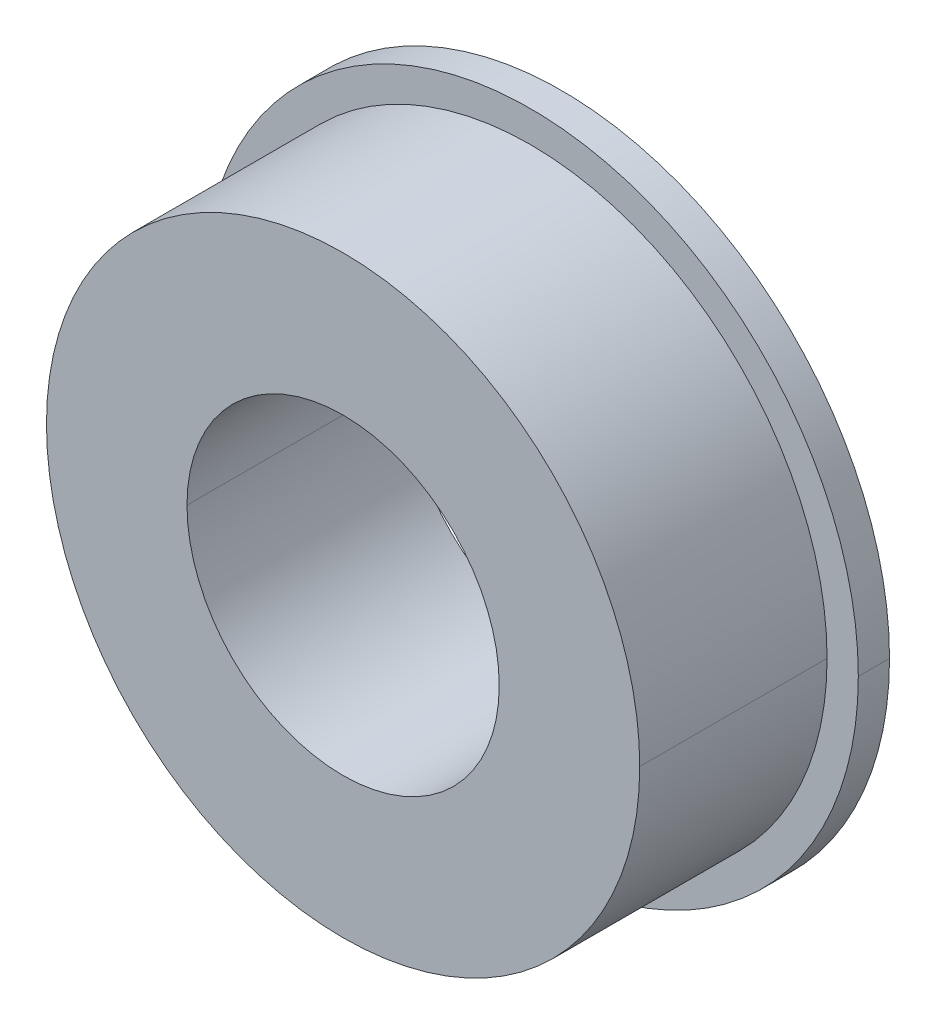
ISO-10303-21;
HEADER;
FILE_DESCRIPTION(('STEP AP214'),'2;1');
FILE_NAME('part.step','',(''),(''),'','','');
FILE_SCHEMA(('AUTOMOTIVE_DESIGN { 1 0 10303 214 1 1 1 1 }'));
ENDSEC;
DATA;
#1=APPLICATION_CONTEXT('core data for automotive mechanical design processes');
#2=APPLICATION_PROTOCOL_DEFINITION('international standard','automotive_design',2000,#1);
#3=PRODUCT_CONTEXT('',#1,'mechanical');
#4=PRODUCT('Part','Part','',(#3));
#5=PRODUCT_RELATED_PRODUCT_CATEGORY('part','',(#4));
#6=PRODUCT_DEFINITION_FORMATION('','',#4);
#7=PRODUCT_DEFINITION_CONTEXT('part definition',#1,'design');
#8=PRODUCT_DEFINITION('design','',#6,#7);
#9=PRODUCT_DEFINITION_SHAPE('','',#8);
#10=(LENGTH_UNIT() NAMED_UNIT(*) SI_UNIT(.MILLI.,.METRE.));
#11=(NAMED_UNIT(*) PLANE_ANGLE_UNIT() SI_UNIT($,.RADIAN.));
#12=(NAMED_UNIT(*) SI_UNIT($,.STERADIAN.) SOLID_ANGLE_UNIT());
#13=UNCERTAINTY_MEASURE_WITH_UNIT(LENGTH_MEASURE(1.E-05),#10,'distance_accuracy_value','');
#14=(GEOMETRIC_REPRESENTATION_CONTEXT(3) GLOBAL_UNCERTAINTY_ASSIGNED_CONTEXT((#13)) GLOBAL_UNIT_ASSIGNED_CONTEXT((#10,
#11,#12)) REPRESENTATION_CONTEXT('',''));
#15=CARTESIAN_POINT('',(0.,0.,0.));
#16=DIRECTION('',(0.,0.,1.));
#17=DIRECTION('',(1.,0.,0.));
#18=AXIS2_PLACEMENT_3D('',#15,#16,#17);
#19=CARTESIAN_POINT('',(0.,0.,1.));
#20=DIRECTION('',(0.,0.,-1.));
#21=DIRECTION('',(-1.,0.,0.));
#22=AXIS2_PLACEMENT_3D('',#19,#20,#21);
#23=CYLINDRICAL_SURFACE('',#22,10.5);
#24=CARTESIAN_POINT('',(0.,0.,1.));
#25=DIRECTION('',(0.,0.,-1.));
#26=DIRECTION('',(-1.,0.,0.));
#27=AXIS2_PLACEMENT_3D('',#24,#25,#26);
#28=CIRCLE('',#27,10.5);
#29=CARTESIAN_POINT('',(-10.5,0.,1.));
#30=VERTEX_POINT('',#29);
#31=CARTESIAN_POINT('',(10.5,0.,1.));
#32=VERTEX_POINT('',#31);
#33=EDGE_CURVE('E11',#30,#32,#28,.T.);
#34=ORIENTED_EDGE('',*,*,#33,.T.);
#35=DIRECTION('',(0.,0.,-1.));
#36=VECTOR('',#35,1.);
#37=CARTESIAN_POINT('',(10.5,0.,1.));
#38=LINE('',#37,#36);
#39=CARTESIAN_POINT('',(10.5,0.,0.));
#40=VERTEX_POINT('',#39);
#41=EDGE_CURVE('E28',#32,#40,#38,.T.);
#42=ORIENTED_EDGE('',*,*,#41,.T.);
#43=CARTESIAN_POINT('',(0.,0.,0.));
#44=DIRECTION('',(0.,0.,-1.));
#45=DIRECTION('',(-1.,0.,0.));
#46=AXIS2_PLACEMENT_3D('',#43,#44,#45);
#47=CIRCLE('',#46,10.5);
#48=CARTESIAN_POINT('',(-10.5,0.,0.));
#49=VERTEX_POINT('',#48);
#50=EDGE_CURVE('E141',#49,#40,#47,.T.);
#51=ORIENTED_EDGE('',*,*,#50,.F.);
#52=DIRECTION('',(0.,0.,-1.));
#53=VECTOR('',#52,1.);
#54=CARTESIAN_POINT('',(-10.5,0.,1.));
#55=LINE('',#54,#53);
#56=EDGE_CURVE('E154',#30,#49,#55,.T.);
#57=ORIENTED_EDGE('',*,*,#56,.F.);
#58=EDGE_LOOP('',(#34,#42,#51,#57));
#59=FACE_BOUND('',#58,.T.);
#60=ADVANCED_FACE('F17',(#59),#23,.T.);
#61=CARTESIAN_POINT('',(0.,0.,7.));
#62=DIRECTION('',(0.,0.,-1.));
#63=DIRECTION('',(-1.,0.,0.));
#64=AXIS2_PLACEMENT_3D('',#61,#62,#63);
#65=CYLINDRICAL_SURFACE('',#64,5.);
#66=CARTESIAN_POINT('',(0.,0.,7.));
#67=DIRECTION('',(0.,0.,1.));
#68=DIRECTION('',(1.,0.,0.));
#69=AXIS2_PLACEMENT_3D('',#66,#67,#68);
#70=CIRCLE('',#69,5.);
#71=CARTESIAN_POINT('',(-5.,0.,7.));
#72=VERTEX_POINT('',#71);
#73=CARTESIAN_POINT('',(5.,0.,7.));
#74=VERTEX_POINT('',#73);
#75=EDGE_CURVE('E88',#72,#74,#70,.T.);
#76=ORIENTED_EDGE('',*,*,#75,.T.);
#77=DIRECTION('',(0.,0.,-1.));
#78=VECTOR('',#77,1.);
#79=CARTESIAN_POINT('',(5.,0.,7.));
#80=LINE('',#79,#78);
#81=CARTESIAN_POINT('',(5.,0.,0.));
#82=VERTEX_POINT('',#81);
#83=EDGE_CURVE('E102',#74,#82,#80,.T.);
#84=ORIENTED_EDGE('',*,*,#83,.T.);
#85=CARTESIAN_POINT('',(0.,0.,0.));
#86=DIRECTION('',(0.,0.,1.));
#87=DIRECTION('',(1.,0.,0.));
#88=AXIS2_PLACEMENT_3D('',#85,#86,#87);
#89=CIRCLE('',#88,5.);
#90=CARTESIAN_POINT('',(-5.,0.,0.));
#91=VERTEX_POINT('',#90);
#92=EDGE_CURVE('E91',#91,#82,#89,.T.);
#93=ORIENTED_EDGE('',*,*,#92,.F.);
#94=DIRECTION('',(0.,0.,-1.));
#95=VECTOR('',#94,1.);
#96=CARTESIAN_POINT('',(-5.,0.,7.));
#97=LINE('',#96,#95);
#98=EDGE_CURVE('E85',#72,#91,#97,.T.);
#99=ORIENTED_EDGE('',*,*,#98,.F.);
#100=EDGE_LOOP('',(#76,#84,#93,#99));
#101=FACE_BOUND('',#100,.T.);
#102=ADVANCED_FACE('F19',(#101),#65,.F.);
#103=CARTESIAN_POINT('',(0.,0.,7.));
#104=DIRECTION('',(0.,0.,-1.));
#105=DIRECTION('',(-1.,0.,0.));
#106=AXIS2_PLACEMENT_3D('',#103,#104,#105);
#107=CYLINDRICAL_SURFACE('',#106,9.5);
#108=CARTESIAN_POINT('',(0.,0.,7.));
#109=DIRECTION('',(0.,0.,1.));
#110=DIRECTION('',(1.,0.,0.));
#111=AXIS2_PLACEMENT_3D('',#108,#109,#110);
#112=CIRCLE('',#111,9.5);
#113=CARTESIAN_POINT('',(9.5,0.,7.));
#114=VERTEX_POINT('',#113);
#115=CARTESIAN_POINT('',(-9.5,0.,7.));
#116=VERTEX_POINT('',#115);
#117=EDGE_CURVE('E76',#114,#116,#112,.T.);
#118=ORIENTED_EDGE('',*,*,#117,.F.);
#119=DIRECTION('',(0.,0.,-1.));
#120=VECTOR('',#119,1.);
#121=CARTESIAN_POINT('',(9.5,0.,7.));
#122=LINE('',#121,#120);
#123=CARTESIAN_POINT('',(9.5,0.,1.));
#124=VERTEX_POINT('',#123);
#125=EDGE_CURVE('E115',#114,#124,#122,.T.);
#126=ORIENTED_EDGE('',*,*,#125,.T.);
#127=CARTESIAN_POINT('',(0.,0.,1.));
#128=DIRECTION('',(0.,0.,-1.));
#129=DIRECTION('',(-1.,0.,0.));
#130=AXIS2_PLACEMENT_3D('',#127,#128,#129);
#131=CIRCLE('',#130,9.5);
#132=CARTESIAN_POINT('',(-9.5,0.,1.));
#133=VERTEX_POINT('',#132);
#134=EDGE_CURVE('E140',#133,#124,#131,.T.);
#135=ORIENTED_EDGE('',*,*,#134,.F.);
#136=DIRECTION('',(0.,0.,-1.));
#137=VECTOR('',#136,1.);
#138=CARTESIAN_POINT('',(-9.5,0.,7.));
#139=LINE('',#138,#137);
#140=EDGE_CURVE('E116',#116,#133,#139,.T.);
#141=ORIENTED_EDGE('',*,*,#140,.F.);
#142=EDGE_LOOP('',(#118,#126,#135,#141));
#143=FACE_BOUND('',#142,.T.);
#144=ADVANCED_FACE('F191',(#143),#107,.T.);
#145=CARTESIAN_POINT('',(0.,0.,7.));
#146=DIRECTION('',(0.,0.,-1.));
#147=DIRECTION('',(-1.,0.,0.));
#148=AXIS2_PLACEMENT_3D('',#145,#146,#147);
#149=CYLINDRICAL_SURFACE('',#148,9.5);
#150=ORIENTED_EDGE('',*,*,#125,.F.);
#151=CARTESIAN_POINT('',(0.,0.,7.));
#152=DIRECTION('',(0.,0.,1.));
#153=DIRECTION('',(1.,0.,0.));
#154=AXIS2_PLACEMENT_3D('',#151,#152,#153);
#155=CIRCLE('',#154,9.5);
#156=EDGE_CURVE('E126',#116,#114,#155,.T.);
#157=ORIENTED_EDGE('',*,*,#156,.F.);
#158=ORIENTED_EDGE('',*,*,#140,.T.);
#159=CARTESIAN_POINT('',(0.,0.,1.));
#160=DIRECTION('',(0.,0.,-1.));
#161=DIRECTION('',(-1.,0.,0.));
#162=AXIS2_PLACEMENT_3D('',#159,#160,#161);
#163=CIRCLE('',#162,9.5);
#164=EDGE_CURVE('E149',#124,#133,#163,.T.);
#165=ORIENTED_EDGE('',*,*,#164,.F.);
#166=EDGE_LOOP('',(#150,#157,#158,#165));
#167=FACE_BOUND('',#166,.T.);
#168=ADVANCED_FACE('F195',(#167),#149,.T.);
#169=CARTESIAN_POINT('',(0.,0.,7.));
#170=DIRECTION('',(0.,0.,1.));
#171=DIRECTION('',(1.,0.,0.));
#172=AXIS2_PLACEMENT_3D('',#169,#170,#171);
#173=PLANE('',#172);
#174=ORIENTED_EDGE('',*,*,#156,.T.);
#175=ORIENTED_EDGE('',*,*,#117,.T.);
#176=EDGE_LOOP('',(#174,#175));
#177=FACE_BOUND('',#176,.T.);
#178=ORIENTED_EDGE('',*,*,#75,.F.);
#179=CARTESIAN_POINT('',(0.,0.,7.));
#180=DIRECTION('',(0.,0.,1.));
#181=DIRECTION('',(1.,0.,0.));
#182=AXIS2_PLACEMENT_3D('',#179,#180,#181);
#183=CIRCLE('',#182,5.);
#184=EDGE_CURVE('E97',#74,#72,#183,.T.);
#185=ORIENTED_EDGE('',*,*,#184,.F.);
#186=EDGE_LOOP('',(#178,#185));
#187=FACE_BOUND('',#186,.T.);
#188=ADVANCED_FACE('F100',(#177,#187),#173,.T.);
#189=CARTESIAN_POINT('',(0.,0.,0.));
#190=DIRECTION('',(0.,0.,1.));
#191=DIRECTION('',(1.,0.,0.));
#192=AXIS2_PLACEMENT_3D('',#189,#190,#191);
#193=PLANE('',#192);
#194=ORIENTED_EDGE('',*,*,#50,.T.);
#195=CARTESIAN_POINT('',(0.,0.,0.));
#196=DIRECTION('',(0.,0.,-1.));
#197=DIRECTION('',(-1.,0.,0.));
#198=AXIS2_PLACEMENT_3D('',#195,#196,#197);
#199=CIRCLE('',#198,10.5);
#200=EDGE_CURVE('E143',#40,#49,#199,.T.);
#201=ORIENTED_EDGE('',*,*,#200,.T.);
#202=EDGE_LOOP('',(#194,#201));
#203=FACE_BOUND('',#202,.T.);
#204=ORIENTED_EDGE('',*,*,#92,.T.);
#205=CARTESIAN_POINT('',(0.,0.,0.));
#206=DIRECTION('',(0.,0.,1.));
#207=DIRECTION('',(1.,0.,0.));
#208=AXIS2_PLACEMENT_3D('',#205,#206,#207);
#209=CIRCLE('',#208,5.);
#210=EDGE_CURVE('E106',#82,#91,#209,.T.);
#211=ORIENTED_EDGE('',*,*,#210,.T.);
#212=EDGE_LOOP('',(#204,#211));
#213=FACE_BOUND('',#212,.T.);
#214=ADVANCED_FACE('F168',(#203,#213),#193,.F.);
#215=CARTESIAN_POINT('',(0.,0.,7.));
#216=DIRECTION('',(0.,0.,-1.));
#217=DIRECTION('',(-1.,0.,0.));
#218=AXIS2_PLACEMENT_3D('',#215,#216,#217);
#219=CYLINDRICAL_SURFACE('',#218,5.);
#220=ORIENTED_EDGE('',*,*,#83,.F.);
#221=ORIENTED_EDGE('',*,*,#184,.T.);
#222=ORIENTED_EDGE('',*,*,#98,.T.);
#223=ORIENTED_EDGE('',*,*,#210,.F.);
#224=EDGE_LOOP('',(#220,#221,#222,#223));
#225=FACE_BOUND('',#224,.T.);
#226=ADVANCED_FACE('F104',(#225),#219,.F.);
#227=CARTESIAN_POINT('',(0.,0.,1.));
#228=DIRECTION('',(0.,0.,-1.));
#229=DIRECTION('',(-1.,0.,0.));
#230=AXIS2_PLACEMENT_3D('',#227,#228,#229);
#231=CYLINDRICAL_SURFACE('',#230,10.5);
#232=ORIENTED_EDGE('',*,*,#41,.F.);
#233=CARTESIAN_POINT('',(0.,0.,1.));
#234=DIRECTION('',(0.,0.,-1.));
#235=DIRECTION('',(-1.,0.,0.));
#236=AXIS2_PLACEMENT_3D('',#233,#234,#235);
#237=CIRCLE('',#236,10.5);
#238=EDGE_CURVE('E21',#32,#30,#237,.T.);
#239=ORIENTED_EDGE('',*,*,#238,.T.);
#240=ORIENTED_EDGE('',*,*,#56,.T.);
#241=ORIENTED_EDGE('',*,*,#200,.F.);
#242=EDGE_LOOP('',(#232,#239,#240,#241));
#243=FACE_BOUND('',#242,.T.);
#244=ADVANCED_FACE('F173',(#243),#231,.T.);
#245=CARTESIAN_POINT('',(0.,0.,1.));
#246=DIRECTION('',(0.,0.,-1.));
#247=DIRECTION('',(0.,-1.,0.));
#248=AXIS2_PLACEMENT_3D('',#245,#246,#247);
#249=PLANE('',#248);
#250=ORIENTED_EDGE('',*,*,#33,.F.);
#251=ORIENTED_EDGE('',*,*,#238,.F.);
#252=EDGE_LOOP('',(#250,#251));
#253=FACE_BOUND('',#252,.T.);
#254=ORIENTED_EDGE('',*,*,#134,.T.);
#255=ORIENTED_EDGE('',*,*,#164,.T.);
#256=EDGE_LOOP('',(#254,#255));
#257=FACE_BOUND('',#256,.T.);
#258=ADVANCED_FACE('F175',(#253,#257),#249,.F.);
#259=CLOSED_SHELL('',(#60,#102,#144,#168,#188,#214,#226,#244,#258));
#260=MANIFOLD_SOLID_BREP('B1',#259);
#261=ADVANCED_BREP_SHAPE_REPRESENTATION('',(#18,#260),#14);
#262=SHAPE_DEFINITION_REPRESENTATION(#9,#261);
ENDSEC;
END-ISO-10303-21;
